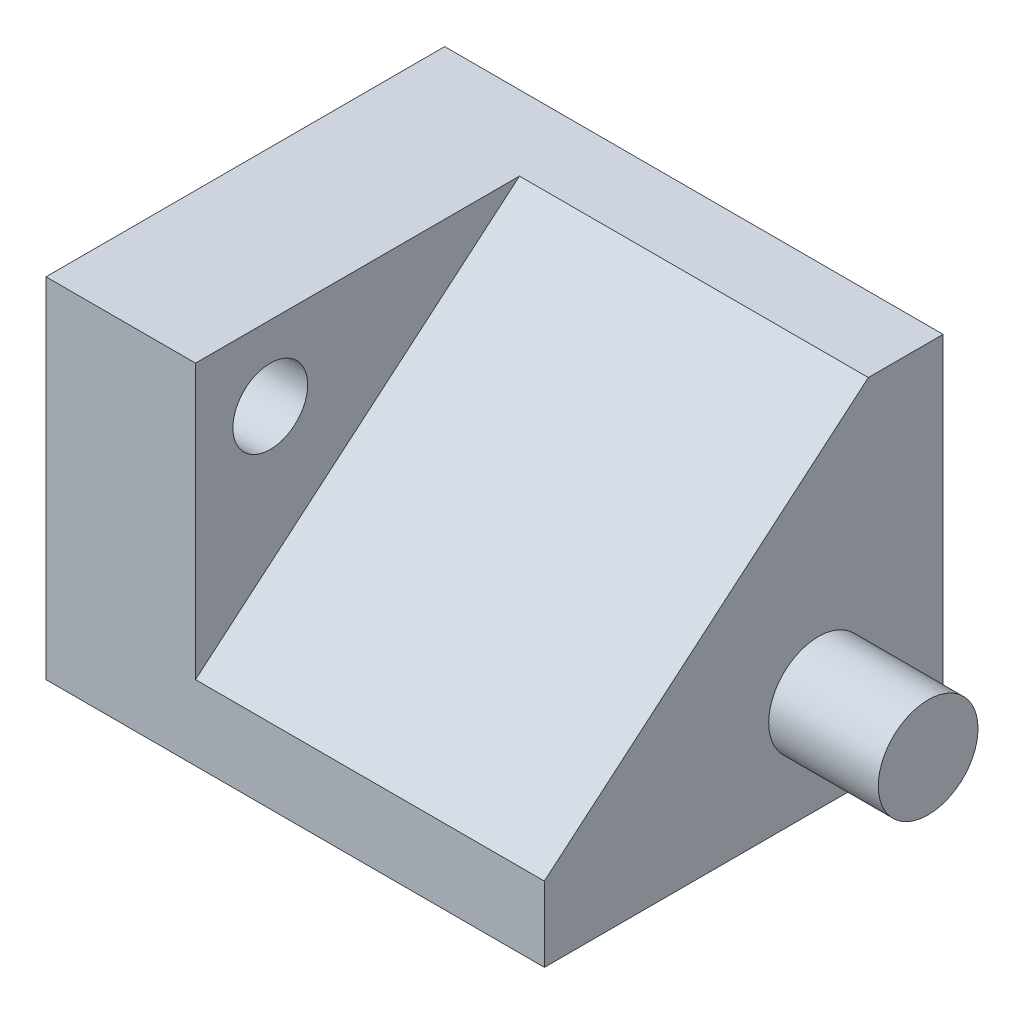
ISO-10303-21;
HEADER;
FILE_DESCRIPTION(('STEP AP214'),'2;1');
FILE_NAME('part.step','',(''),(''),'','','');
FILE_SCHEMA(('AUTOMOTIVE_DESIGN { 1 0 10303 214 1 1 1 1 }'));
ENDSEC;
DATA;
#1=APPLICATION_CONTEXT('core data for automotive mechanical design processes');
#2=APPLICATION_PROTOCOL_DEFINITION('international standard','automotive_design',2000,#1);
#3=PRODUCT_CONTEXT('',#1,'mechanical');
#4=PRODUCT('Part','Part','',(#3));
#5=PRODUCT_RELATED_PRODUCT_CATEGORY('part','',(#4));
#6=PRODUCT_DEFINITION_FORMATION('','',#4);
#7=PRODUCT_DEFINITION_CONTEXT('part definition',#1,'design');
#8=PRODUCT_DEFINITION('design','',#6,#7);
#9=PRODUCT_DEFINITION_SHAPE('','',#8);
#10=(LENGTH_UNIT() NAMED_UNIT(*) SI_UNIT(.MILLI.,.METRE.));
#11=(NAMED_UNIT(*) PLANE_ANGLE_UNIT() SI_UNIT($,.RADIAN.));
#12=(NAMED_UNIT(*) SI_UNIT($,.STERADIAN.) SOLID_ANGLE_UNIT());
#13=UNCERTAINTY_MEASURE_WITH_UNIT(LENGTH_MEASURE(1.E-05),#10,'distance_accuracy_value','');
#14=(GEOMETRIC_REPRESENTATION_CONTEXT(3) GLOBAL_UNCERTAINTY_ASSIGNED_CONTEXT((#13)) GLOBAL_UNIT_ASSIGNED_CONTEXT((#10,
#11,#12)) REPRESENTATION_CONTEXT('',''));
#15=CARTESIAN_POINT('',(0.,0.,0.));
#16=DIRECTION('',(0.,0.,1.));
#17=DIRECTION('',(1.,0.,0.));
#18=AXIS2_PLACEMENT_3D('',#15,#16,#17);
#19=CARTESIAN_POINT('',(-88.9,88.9,0.));
#20=DIRECTION('',(-1.,0.,0.));
#21=DIRECTION('',(0.,0.,1.));
#22=AXIS2_PLACEMENT_3D('',#19,#20,#21);
#23=PLANE('',#22);
#24=CARTESIAN_POINT('',(-88.9,69.85,-19.05));
#25=DIRECTION('',(1.,0.,0.));
#26=DIRECTION('',(0.,0.,-1.));
#27=AXIS2_PLACEMENT_3D('',#24,#25,#26);
#28=CIRCLE('',#27,9.52500000000001);
#29=CARTESIAN_POINT('',(-88.9,69.85,-28.575));
#30=VERTEX_POINT('',#29);
#31=EDGE_CURVE('E135',#30,#30,#28,.T.);
#32=ORIENTED_EDGE('',*,*,#31,.F.);
#33=EDGE_LOOP('',(#32));
#34=FACE_BOUND('',#33,.T.);
#35=DIRECTION('',(0.,-0.645942241466174,0.763386285369114));
#36=VECTOR('',#35,1.);
#37=CARTESIAN_POINT('',(-88.9,19.05,0.));
#38=LINE('',#37,#36);
#39=CARTESIAN_POINT('',(-88.9,88.9,-82.55));
#40=VERTEX_POINT('',#39);
#41=CARTESIAN_POINT('',(-88.9,19.05,0.));
#42=VERTEX_POINT('',#41);
#43=EDGE_CURVE('E95',#40,#42,#38,.T.);
#44=ORIENTED_EDGE('',*,*,#43,.F.);
#45=DIRECTION('',(0.,0.,-1.));
#46=VECTOR('',#45,1.);
#47=CARTESIAN_POINT('',(-88.9,88.9,0.));
#48=LINE('',#47,#46);
#49=CARTESIAN_POINT('',(-88.9,88.9,0.));
#50=VERTEX_POINT('',#49);
#51=EDGE_CURVE('E82',#50,#40,#48,.T.);
#52=ORIENTED_EDGE('',*,*,#51,.F.);
#53=DIRECTION('',(0.,-1.,0.));
#54=VECTOR('',#53,1.);
#55=CARTESIAN_POINT('',(-88.9,88.9,0.));
#56=LINE('',#55,#54);
#57=EDGE_CURVE('E96',#50,#42,#56,.T.);
#58=ORIENTED_EDGE('',*,*,#57,.T.);
#59=EDGE_LOOP('',(#44,#52,#58));
#60=FACE_BOUND('',#59,.T.);
#61=ADVANCED_FACE('F33',(#34,#60),#23,.F.);
#62=CARTESIAN_POINT('',(0.,19.05,0.));
#63=DIRECTION('',(0.,0.,1.));
#64=DIRECTION('',(1.,0.,0.));
#65=AXIS2_PLACEMENT_3D('',#62,#63,#64);
#66=PLANE('',#65);
#67=DIRECTION('',(-1.,0.,0.));
#68=VECTOR('',#67,1.);
#69=CARTESIAN_POINT('',(0.,0.,0.));
#70=LINE('',#69,#68);
#71=CARTESIAN_POINT('',(0.,0.,0.));
#72=VERTEX_POINT('',#71);
#73=CARTESIAN_POINT('',(-127.,0.,0.));
#74=VERTEX_POINT('',#73);
#75=EDGE_CURVE('E128',#72,#74,#70,.T.);
#76=ORIENTED_EDGE('',*,*,#75,.F.);
#77=DIRECTION('',(0.,-1.,0.));
#78=VECTOR('',#77,1.);
#79=CARTESIAN_POINT('',(0.,19.05,0.));
#80=LINE('',#79,#78);
#81=CARTESIAN_POINT('',(0.,19.05,0.));
#82=VERTEX_POINT('',#81);
#83=EDGE_CURVE('E42',#82,#72,#80,.T.);
#84=ORIENTED_EDGE('',*,*,#83,.F.);
#85=DIRECTION('',(-1.,0.,0.));
#86=VECTOR('',#85,1.);
#87=CARTESIAN_POINT('',(0.,19.05,0.));
#88=LINE('',#87,#86);
#89=EDGE_CURVE('E129',#82,#42,#88,.T.);
#90=ORIENTED_EDGE('',*,*,#89,.T.);
#91=ORIENTED_EDGE('',*,*,#57,.F.);
#92=DIRECTION('',(-1.,0.,0.));
#93=VECTOR('',#92,1.);
#94=CARTESIAN_POINT('',(0.,88.9,0.));
#95=LINE('',#94,#93);
#96=CARTESIAN_POINT('',(-127.,88.9,0.));
#97=VERTEX_POINT('',#96);
#98=EDGE_CURVE('E90',#50,#97,#95,.T.);
#99=ORIENTED_EDGE('',*,*,#98,.T.);
#100=DIRECTION('',(0.,-1.,0.));
#101=VECTOR('',#100,1.);
#102=CARTESIAN_POINT('',(-127.,88.9,0.));
#103=LINE('',#102,#101);
#104=EDGE_CURVE('E113',#97,#74,#103,.T.);
#105=ORIENTED_EDGE('',*,*,#104,.T.);
#106=EDGE_LOOP('',(#76,#84,#90,#91,#99,#105));
#107=FACE_BOUND('',#106,.T.);
#108=ADVANCED_FACE('F35',(#107),#66,.T.);
#109=CARTESIAN_POINT('',(0.,19.05,0.));
#110=DIRECTION('',(-1.,0.,0.));
#111=DIRECTION('',(0.,0.,1.));
#112=AXIS2_PLACEMENT_3D('',#109,#110,#111);
#113=PLANE('',#112);
#114=CARTESIAN_POINT('',(0.,25.4,-69.85));
#115=DIRECTION('',(-1.,0.,0.));
#116=DIRECTION('',(0.,0.,1.));
#117=AXIS2_PLACEMENT_3D('',#114,#115,#116);
#118=CIRCLE('',#117,12.7);
#119=CARTESIAN_POINT('',(0.,25.4,-57.15));
#120=VERTEX_POINT('',#119);
#121=EDGE_CURVE('E11',#120,#120,#118,.F.);
#122=ORIENTED_EDGE('',*,*,#121,.F.);
#123=EDGE_LOOP('',(#122));
#124=FACE_BOUND('',#123,.T.);
#125=DIRECTION('',(0.,0.,-1.));
#126=VECTOR('',#125,1.);
#127=CARTESIAN_POINT('',(0.,0.,0.));
#128=LINE('',#127,#126);
#129=CARTESIAN_POINT('',(0.,0.,-101.6));
#130=VERTEX_POINT('',#129);
#131=EDGE_CURVE('E131',#72,#130,#128,.T.);
#132=ORIENTED_EDGE('',*,*,#131,.T.);
#133=DIRECTION('',(0.,-1.,0.));
#134=VECTOR('',#133,1.);
#135=CARTESIAN_POINT('',(0.,88.9,-101.6));
#136=LINE('',#135,#134);
#137=CARTESIAN_POINT('',(0.,88.9,-101.6));
#138=VERTEX_POINT('',#137);
#139=EDGE_CURVE('E124',#138,#130,#136,.T.);
#140=ORIENTED_EDGE('',*,*,#139,.F.);
#141=DIRECTION('',(0.,0.,-1.));
#142=VECTOR('',#141,1.);
#143=CARTESIAN_POINT('',(0.,88.9,0.));
#144=LINE('',#143,#142);
#145=CARTESIAN_POINT('',(0.,88.9,-82.55));
#146=VERTEX_POINT('',#145);
#147=EDGE_CURVE('E103',#146,#138,#144,.T.);
#148=ORIENTED_EDGE('',*,*,#147,.F.);
#149=DIRECTION('',(0.,-0.645942241466174,0.763386285369114));
#150=VECTOR('',#149,1.);
#151=CARTESIAN_POINT('',(0.,19.05,0.));
#152=LINE('',#151,#150);
#153=EDGE_CURVE('E99',#146,#82,#152,.T.);
#154=ORIENTED_EDGE('',*,*,#153,.T.);
#155=ORIENTED_EDGE('',*,*,#83,.T.);
#156=EDGE_LOOP('',(#132,#140,#148,#154,#155));
#157=FACE_BOUND('',#156,.T.);
#158=ADVANCED_FACE('F156',(#124,#157),#113,.F.);
#159=CARTESIAN_POINT('',(0.,0.,0.));
#160=DIRECTION('',(0.,1.,0.));
#161=DIRECTION('',(0.,0.,1.));
#162=AXIS2_PLACEMENT_3D('',#159,#160,#161);
#163=PLANE('',#162);
#164=ORIENTED_EDGE('',*,*,#75,.T.);
#165=DIRECTION('',(0.,0.,-1.));
#166=VECTOR('',#165,1.);
#167=CARTESIAN_POINT('',(-127.,0.,0.));
#168=LINE('',#167,#166);
#169=CARTESIAN_POINT('',(-127.,0.,-101.6));
#170=VERTEX_POINT('',#169);
#171=EDGE_CURVE('E117',#74,#170,#168,.T.);
#172=ORIENTED_EDGE('',*,*,#171,.T.);
#173=DIRECTION('',(-1.,0.,0.));
#174=VECTOR('',#173,1.);
#175=CARTESIAN_POINT('',(0.,0.,-101.6));
#176=LINE('',#175,#174);
#177=EDGE_CURVE('E114',#130,#170,#176,.T.);
#178=ORIENTED_EDGE('',*,*,#177,.F.);
#179=ORIENTED_EDGE('',*,*,#131,.F.);
#180=EDGE_LOOP('',(#164,#172,#178,#179));
#181=FACE_BOUND('',#180,.T.);
#182=ADVANCED_FACE('F153',(#181),#163,.F.);
#183=CARTESIAN_POINT('',(0.,88.9,-101.6));
#184=DIRECTION('',(0.,0.,1.));
#185=DIRECTION('',(1.,0.,0.));
#186=AXIS2_PLACEMENT_3D('',#183,#184,#185);
#187=PLANE('',#186);
#188=ORIENTED_EDGE('',*,*,#177,.T.);
#189=DIRECTION('',(0.,-1.,0.));
#190=VECTOR('',#189,1.);
#191=CARTESIAN_POINT('',(-127.,88.9,-101.6));
#192=LINE('',#191,#190);
#193=CARTESIAN_POINT('',(-127.,88.9,-101.6));
#194=VERTEX_POINT('',#193);
#195=EDGE_CURVE('E122',#194,#170,#192,.T.);
#196=ORIENTED_EDGE('',*,*,#195,.F.);
#197=DIRECTION('',(-1.,0.,0.));
#198=VECTOR('',#197,1.);
#199=CARTESIAN_POINT('',(0.,88.9,-101.6));
#200=LINE('',#199,#198);
#201=EDGE_CURVE('E105',#138,#194,#200,.T.);
#202=ORIENTED_EDGE('',*,*,#201,.F.);
#203=ORIENTED_EDGE('',*,*,#139,.T.);
#204=EDGE_LOOP('',(#188,#196,#202,#203));
#205=FACE_BOUND('',#204,.T.);
#206=ADVANCED_FACE('F159',(#205),#187,.F.);
#207=CARTESIAN_POINT('',(-127.,88.9,0.));
#208=DIRECTION('',(-1.,0.,0.));
#209=DIRECTION('',(0.,0.,1.));
#210=AXIS2_PLACEMENT_3D('',#207,#208,#209);
#211=PLANE('',#210);
#212=CARTESIAN_POINT('',(-127.,69.85,-19.05));
#213=DIRECTION('',(-1.,0.,0.));
#214=DIRECTION('',(0.,0.,1.));
#215=AXIS2_PLACEMENT_3D('',#212,#213,#214);
#216=CIRCLE('',#215,9.52500000000001);
#217=CARTESIAN_POINT('',(-127.,69.85,-9.525));
#218=VERTEX_POINT('',#217);
#219=EDGE_CURVE('E100',#218,#218,#216,.T.);
#220=ORIENTED_EDGE('',*,*,#219,.F.);
#221=EDGE_LOOP('',(#220));
#222=FACE_BOUND('',#221,.T.);
#223=ORIENTED_EDGE('',*,*,#171,.F.);
#224=ORIENTED_EDGE('',*,*,#104,.F.);
#225=DIRECTION('',(0.,0.,-1.));
#226=VECTOR('',#225,1.);
#227=CARTESIAN_POINT('',(-127.,88.9,0.));
#228=LINE('',#227,#226);
#229=EDGE_CURVE('E110',#97,#194,#228,.T.);
#230=ORIENTED_EDGE('',*,*,#229,.T.);
#231=ORIENTED_EDGE('',*,*,#195,.T.);
#232=EDGE_LOOP('',(#223,#224,#230,#231));
#233=FACE_BOUND('',#232,.T.);
#234=ADVANCED_FACE('F150',(#222,#233),#211,.T.);
#235=CARTESIAN_POINT('',(0.,88.9,0.));
#236=DIRECTION('',(0.,1.,0.));
#237=DIRECTION('',(0.,0.,1.));
#238=AXIS2_PLACEMENT_3D('',#235,#236,#237);
#239=PLANE('',#238);
#240=ORIENTED_EDGE('',*,*,#98,.F.);
#241=ORIENTED_EDGE('',*,*,#51,.T.);
#242=DIRECTION('',(-1.,0.,0.));
#243=VECTOR('',#242,1.);
#244=CARTESIAN_POINT('',(0.,88.9,-82.55));
#245=LINE('',#244,#243);
#246=EDGE_CURVE('E86',#146,#40,#245,.T.);
#247=ORIENTED_EDGE('',*,*,#246,.F.);
#248=ORIENTED_EDGE('',*,*,#147,.T.);
#249=ORIENTED_EDGE('',*,*,#201,.T.);
#250=ORIENTED_EDGE('',*,*,#229,.F.);
#251=EDGE_LOOP('',(#240,#241,#247,#248,#249,#250));
#252=FACE_BOUND('',#251,.T.);
#253=ADVANCED_FACE('F84',(#252),#239,.T.);
#254=CARTESIAN_POINT('',(0.,19.05,0.));
#255=DIRECTION('',(0.,-0.763386285369114,-0.645942241466174));
#256=DIRECTION('',(0.,0.645942241466174,-0.763386285369114));
#257=AXIS2_PLACEMENT_3D('',#254,#255,#256);
#258=PLANE('',#257);
#259=ORIENTED_EDGE('',*,*,#43,.T.);
#260=ORIENTED_EDGE('',*,*,#89,.F.);
#261=ORIENTED_EDGE('',*,*,#153,.F.);
#262=ORIENTED_EDGE('',*,*,#246,.T.);
#263=EDGE_LOOP('',(#259,#260,#261,#262));
#264=FACE_BOUND('',#263,.T.);
#265=ADVANCED_FACE('F102',(#264),#258,.F.);
#266=CARTESIAN_POINT('',(-177.8,69.85,-19.05));
#267=DIRECTION('',(1.,0.,0.));
#268=DIRECTION('',(0.,0.,-1.));
#269=AXIS2_PLACEMENT_3D('',#266,#267,#268);
#270=CYLINDRICAL_SURFACE('',#269,9.52500000000001);
#271=ORIENTED_EDGE('',*,*,#219,.T.);
#272=EDGE_LOOP('',(#271));
#273=FACE_BOUND('',#272,.T.);
#274=ORIENTED_EDGE('',*,*,#31,.T.);
#275=EDGE_LOOP('',(#274));
#276=FACE_BOUND('',#275,.T.);
#277=ADVANCED_FACE('F184',(#273,#276),#270,.F.);
#278=CARTESIAN_POINT('',(27.94,25.4,-69.85));
#279=DIRECTION('',(-1.,0.,0.));
#280=DIRECTION('',(0.,0.,1.));
#281=AXIS2_PLACEMENT_3D('',#278,#279,#280);
#282=CYLINDRICAL_SURFACE('',#281,12.7);
#283=CARTESIAN_POINT('',(27.94,25.4,-69.85));
#284=DIRECTION('',(1.,0.,0.));
#285=DIRECTION('',(0.,0.,-1.));
#286=AXIS2_PLACEMENT_3D('',#283,#284,#285);
#287=CIRCLE('',#286,12.7);
#288=CARTESIAN_POINT('',(27.94,25.4,-82.55));
#289=VERTEX_POINT('',#288);
#290=EDGE_CURVE('E139',#289,#289,#287,.T.);
#291=ORIENTED_EDGE('',*,*,#290,.F.);
#292=EDGE_LOOP('',(#291));
#293=FACE_BOUND('',#292,.T.);
#294=ORIENTED_EDGE('',*,*,#121,.T.);
#295=EDGE_LOOP('',(#294));
#296=FACE_BOUND('',#295,.T.);
#297=ADVANCED_FACE('F181',(#293,#296),#282,.T.);
#298=CARTESIAN_POINT('',(27.94,25.4,-69.85));
#299=DIRECTION('',(1.,0.,0.));
#300=DIRECTION('',(0.,0.,-1.));
#301=AXIS2_PLACEMENT_3D('',#298,#299,#300);
#302=PLANE('',#301);
#303=ORIENTED_EDGE('',*,*,#290,.T.);
#304=EDGE_LOOP('',(#303));
#305=FACE_BOUND('',#304,.T.);
#306=ADVANCED_FACE('F183',(#305),#302,.T.);
#307=CLOSED_SHELL('',(#61,#108,#158,#182,#206,#234,#253,#265,#277,#297,#306));
#308=MANIFOLD_SOLID_BREP('B2',#307);
#309=ADVANCED_BREP_SHAPE_REPRESENTATION('',(#18,#308),#14);
#310=SHAPE_DEFINITION_REPRESENTATION(#9,#309);
ENDSEC;
END-ISO-10303-21;
